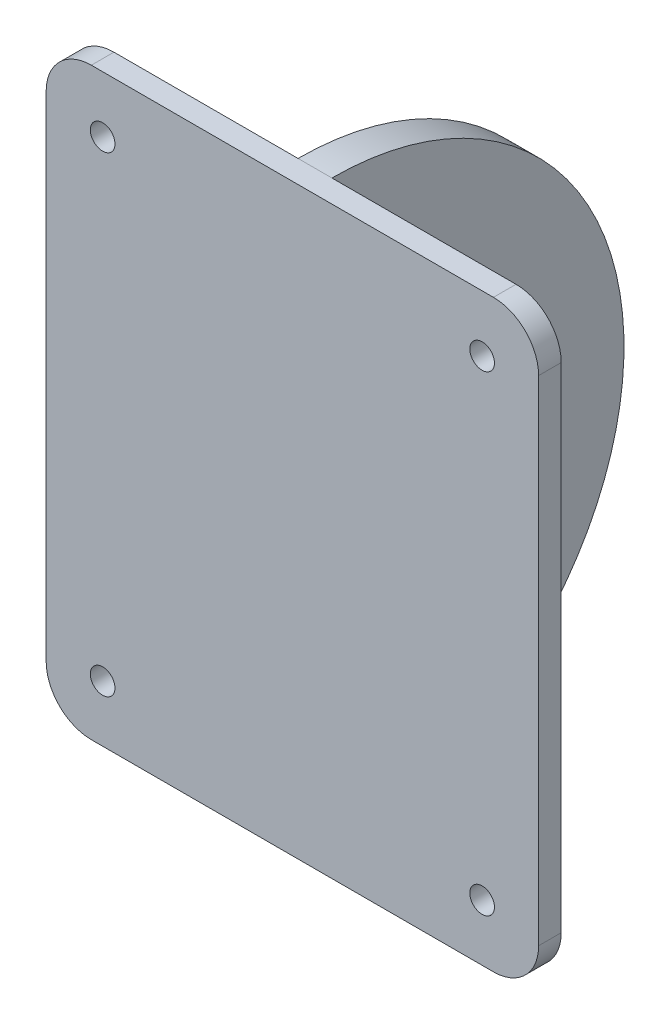
ISO-10303-21;
HEADER;
FILE_DESCRIPTION(('STEP AP214'),'2;1');
FILE_NAME('part.step','',(''),(''),'','','');
FILE_SCHEMA(('AUTOMOTIVE_DESIGN { 1 0 10303 214 1 1 1 1 }'));
ENDSEC;
DATA;
#1=APPLICATION_CONTEXT('core data for automotive mechanical design processes');
#2=APPLICATION_PROTOCOL_DEFINITION('international standard','automotive_design',2000,#1);
#3=PRODUCT_CONTEXT('',#1,'mechanical');
#4=PRODUCT('Part','Part','',(#3));
#5=PRODUCT_RELATED_PRODUCT_CATEGORY('part','',(#4));
#6=PRODUCT_DEFINITION_FORMATION('','',#4);
#7=PRODUCT_DEFINITION_CONTEXT('part definition',#1,'design');
#8=PRODUCT_DEFINITION('design','',#6,#7);
#9=PRODUCT_DEFINITION_SHAPE('','',#8);
#10=(LENGTH_UNIT() NAMED_UNIT(*) SI_UNIT(.MILLI.,.METRE.));
#11=(NAMED_UNIT(*) PLANE_ANGLE_UNIT() SI_UNIT($,.RADIAN.));
#12=(NAMED_UNIT(*) SI_UNIT($,.STERADIAN.) SOLID_ANGLE_UNIT());
#13=UNCERTAINTY_MEASURE_WITH_UNIT(LENGTH_MEASURE(1.E-05),#10,'distance_accuracy_value','');
#14=(GEOMETRIC_REPRESENTATION_CONTEXT(3) GLOBAL_UNCERTAINTY_ASSIGNED_CONTEXT((#13)) GLOBAL_UNIT_ASSIGNED_CONTEXT((#10,
#11,#12)) REPRESENTATION_CONTEXT('',''));
#15=CARTESIAN_POINT('',(0.,0.,0.));
#16=DIRECTION('',(0.,0.,1.));
#17=DIRECTION('',(1.,0.,0.));
#18=AXIS2_PLACEMENT_3D('',#15,#16,#17);
#19=CARTESIAN_POINT('',(0.,0.,0.));
#20=DIRECTION('',(0.,0.,1.));
#21=DIRECTION('',(1.,0.,0.));
#22=AXIS2_PLACEMENT_3D('',#19,#20,#21);
#23=PLANE('',#22);
#24=CARTESIAN_POINT('',(-16.799,20.8583,0.));
#25=DIRECTION('',(0.,0.,1.));
#26=DIRECTION('',(1.,0.,0.));
#27=AXIS2_PLACEMENT_3D('',#24,#25,#26);
#28=CIRCLE('',#27,1.0922);
#29=CARTESIAN_POINT('',(-15.7068,20.8583,0.));
#30=VERTEX_POINT('',#29);
#31=EDGE_CURVE('E175',#30,#30,#28,.T.);
#32=ORIENTED_EDGE('',*,*,#31,.T.);
#33=EDGE_LOOP('',(#32));
#34=FACE_BOUND('',#33,.T.);
#35=CARTESIAN_POINT('',(-16.799,-20.8583,0.));
#36=DIRECTION('',(0.,0.,1.));
#37=DIRECTION('',(1.,0.,0.));
#38=AXIS2_PLACEMENT_3D('',#35,#36,#37);
#39=CIRCLE('',#38,1.0922);
#40=CARTESIAN_POINT('',(-15.7068,-20.8583,0.));
#41=VERTEX_POINT('',#40);
#42=EDGE_CURVE('E160',#41,#41,#39,.T.);
#43=ORIENTED_EDGE('',*,*,#42,.T.);
#44=EDGE_LOOP('',(#43));
#45=FACE_BOUND('',#44,.T.);
#46=DIRECTION('',(0.,-1.,0.));
#47=VECTOR('',#46,1.);
#48=CARTESIAN_POINT('',(-1.5,25.8583,0.));
#49=LINE('',#48,#47);
#50=CARTESIAN_POINT('',(-1.5,25.8583,0.));
#51=VERTEX_POINT('',#50);
#52=CARTESIAN_POINT('',(-1.5,-25.8583,0.));
#53=VERTEX_POINT('',#52);
#54=EDGE_CURVE('E133',#51,#53,#49,.T.);
#55=ORIENTED_EDGE('',*,*,#54,.T.);
#56=DIRECTION('',(1.,0.,0.));
#57=VECTOR('',#56,1.);
#58=CARTESIAN_POINT('',(-21.799,-25.8583,0.));
#59=LINE('',#58,#57);
#60=CARTESIAN_POINT('',(-17.799,-25.8583,0.));
#61=VERTEX_POINT('',#60);
#62=EDGE_CURVE('E184',#61,#53,#59,.T.);
#63=ORIENTED_EDGE('',*,*,#62,.F.);
#64=CARTESIAN_POINT('',(-17.799,-21.8583,0.));
#65=DIRECTION('',(0.,0.,1.));
#66=DIRECTION('',(1.,0.,0.));
#67=AXIS2_PLACEMENT_3D('',#64,#65,#66);
#68=CIRCLE('',#67,4.);
#69=CARTESIAN_POINT('',(-21.799,-21.8583,0.));
#70=VERTEX_POINT('',#69);
#71=EDGE_CURVE('E209',#61,#70,#68,.F.);
#72=ORIENTED_EDGE('',*,*,#71,.T.);
#73=DIRECTION('',(0.,-1.,0.));
#74=VECTOR('',#73,1.);
#75=CARTESIAN_POINT('',(-21.799,25.8583,0.));
#76=LINE('',#75,#74);
#77=CARTESIAN_POINT('',(-21.799,21.8583,0.));
#78=VERTEX_POINT('',#77);
#79=EDGE_CURVE('E196',#78,#70,#76,.T.);
#80=ORIENTED_EDGE('',*,*,#79,.F.);
#81=CARTESIAN_POINT('',(-17.799,21.8583,0.));
#82=DIRECTION('',(0.,0.,1.));
#83=DIRECTION('',(1.,0.,0.));
#84=AXIS2_PLACEMENT_3D('',#81,#82,#83);
#85=CIRCLE('',#84,4.);
#86=CARTESIAN_POINT('',(-17.799,25.8583,0.));
#87=VERTEX_POINT('',#86);
#88=EDGE_CURVE('E136',#78,#87,#85,.F.);
#89=ORIENTED_EDGE('',*,*,#88,.T.);
#90=DIRECTION('',(-1.,0.,0.));
#91=VECTOR('',#90,1.);
#92=CARTESIAN_POINT('',(-21.799,25.8583,0.));
#93=LINE('',#92,#91);
#94=EDGE_CURVE('E119',#51,#87,#93,.T.);
#95=ORIENTED_EDGE('',*,*,#94,.F.);
#96=EDGE_LOOP('',(#55,#63,#72,#80,#89,#95));
#97=FACE_BOUND('',#96,.T.);
#98=ADVANCED_FACE('F41',(#34,#45,#97),#23,.F.);
#99=CARTESIAN_POINT('',(21.799,25.8583,2.));
#100=DIRECTION('',(-1.,0.,0.));
#101=DIRECTION('',(0.,-1.,0.));
#102=AXIS2_PLACEMENT_3D('',#99,#100,#101);
#103=PLANE('',#102);
#104=DIRECTION('',(0.,1.,0.));
#105=VECTOR('',#104,1.);
#106=CARTESIAN_POINT('',(21.799,25.8583,2.));
#107=LINE('',#106,#105);
#108=CARTESIAN_POINT('',(21.799,-21.8583,2.));
#109=VERTEX_POINT('',#108);
#110=CARTESIAN_POINT('',(21.799,21.8583,2.));
#111=VERTEX_POINT('',#110);
#112=EDGE_CURVE('E180',#109,#111,#107,.T.);
#113=ORIENTED_EDGE('',*,*,#112,.F.);
#114=DIRECTION('',(0.,0.,-1.));
#115=VECTOR('',#114,1.);
#116=CARTESIAN_POINT('',(21.799,-21.8583,2.));
#117=LINE('',#116,#115);
#118=CARTESIAN_POINT('',(21.799,-21.8583,0.));
#119=VERTEX_POINT('',#118);
#120=EDGE_CURVE('E226',#109,#119,#117,.T.);
#121=ORIENTED_EDGE('',*,*,#120,.T.);
#122=DIRECTION('',(0.,1.,0.));
#123=VECTOR('',#122,1.);
#124=CARTESIAN_POINT('',(21.799,25.8583,0.));
#125=LINE('',#124,#123);
#126=CARTESIAN_POINT('',(21.799,21.8583,0.));
#127=VERTEX_POINT('',#126);
#128=EDGE_CURVE('E138',#119,#127,#125,.T.);
#129=ORIENTED_EDGE('',*,*,#128,.T.);
#130=DIRECTION('',(0.,0.,-1.));
#131=VECTOR('',#130,1.);
#132=CARTESIAN_POINT('',(21.799,21.8583,2.));
#133=LINE('',#132,#131);
#134=EDGE_CURVE('E224',#127,#111,#133,.F.);
#135=ORIENTED_EDGE('',*,*,#134,.T.);
#136=EDGE_LOOP('',(#113,#121,#129,#135));
#137=FACE_BOUND('',#136,.T.);
#138=ADVANCED_FACE('F237',(#137),#103,.F.);
#139=CARTESIAN_POINT('',(-21.799,25.8583,2.));
#140=DIRECTION('',(0.,-1.,0.));
#141=DIRECTION('',(0.,0.,-1.));
#142=AXIS2_PLACEMENT_3D('',#139,#140,#141);
#143=PLANE('',#142);
#144=CARTESIAN_POINT('',(17.799,25.8583,0.));
#145=VERTEX_POINT('',#144);
#146=CARTESIAN_POINT('',(1.5,25.8583,0.));
#147=VERTEX_POINT('',#146);
#148=EDGE_CURVE('E122',#145,#147,#93,.T.);
#149=ORIENTED_EDGE('',*,*,#148,.T.);
#150=DIRECTION('',(-1.,0.,0.));
#151=VECTOR('',#150,1.);
#152=CARTESIAN_POINT('',(1.5,25.8583,0.));
#153=LINE('',#152,#151);
#154=EDGE_CURVE('E116',#147,#51,#153,.T.);
#155=ORIENTED_EDGE('',*,*,#154,.T.);
#156=ORIENTED_EDGE('',*,*,#94,.T.);
#157=DIRECTION('',(0.,0.,-1.));
#158=VECTOR('',#157,1.);
#159=CARTESIAN_POINT('',(-17.799,25.8583,2.));
#160=LINE('',#159,#158);
#161=CARTESIAN_POINT('',(-17.799,25.8583,2.));
#162=VERTEX_POINT('',#161);
#163=EDGE_CURVE('E11',#87,#162,#160,.F.);
#164=ORIENTED_EDGE('',*,*,#163,.T.);
#165=DIRECTION('',(-1.,0.,0.));
#166=VECTOR('',#165,1.);
#167=CARTESIAN_POINT('',(-21.799,25.8583,2.));
#168=LINE('',#167,#166);
#169=CARTESIAN_POINT('',(17.799,25.8583,2.));
#170=VERTEX_POINT('',#169);
#171=EDGE_CURVE('E183',#170,#162,#168,.T.);
#172=ORIENTED_EDGE('',*,*,#171,.F.);
#173=DIRECTION('',(0.,0.,-1.));
#174=VECTOR('',#173,1.);
#175=CARTESIAN_POINT('',(17.799,25.8583,2.));
#176=LINE('',#175,#174);
#177=EDGE_CURVE('E49',#170,#145,#176,.T.);
#178=ORIENTED_EDGE('',*,*,#177,.T.);
#179=EDGE_LOOP('',(#149,#155,#156,#164,#172,#178));
#180=FACE_BOUND('',#179,.T.);
#181=ADVANCED_FACE('F118',(#180),#143,.F.);
#182=CARTESIAN_POINT('',(-21.799,25.8583,2.));
#183=DIRECTION('',(1.,0.,0.));
#184=DIRECTION('',(0.,1.,0.));
#185=AXIS2_PLACEMENT_3D('',#182,#183,#184);
#186=PLANE('',#185);
#187=ORIENTED_EDGE('',*,*,#79,.T.);
#188=DIRECTION('',(0.,0.,-1.));
#189=VECTOR('',#188,1.);
#190=CARTESIAN_POINT('',(-21.799,-21.8583,2.));
#191=LINE('',#190,#189);
#192=CARTESIAN_POINT('',(-21.799,-21.8583,2.));
#193=VERTEX_POINT('',#192);
#194=EDGE_CURVE('E214',#70,#193,#191,.F.);
#195=ORIENTED_EDGE('',*,*,#194,.T.);
#196=DIRECTION('',(0.,-1.,0.));
#197=VECTOR('',#196,1.);
#198=CARTESIAN_POINT('',(-21.799,25.8583,2.));
#199=LINE('',#198,#197);
#200=CARTESIAN_POINT('',(-21.799,21.8583,2.));
#201=VERTEX_POINT('',#200);
#202=EDGE_CURVE('E187',#201,#193,#199,.T.);
#203=ORIENTED_EDGE('',*,*,#202,.F.);
#204=DIRECTION('',(0.,0.,-1.));
#205=VECTOR('',#204,1.);
#206=CARTESIAN_POINT('',(-21.799,21.8583,2.));
#207=LINE('',#206,#205);
#208=EDGE_CURVE('E211',#201,#78,#207,.T.);
#209=ORIENTED_EDGE('',*,*,#208,.T.);
#210=EDGE_LOOP('',(#187,#195,#203,#209));
#211=FACE_BOUND('',#210,.T.);
#212=ADVANCED_FACE('F256',(#211),#186,.F.);
#213=CARTESIAN_POINT('',(-21.799,-25.8583,2.));
#214=DIRECTION('',(0.,1.,0.));
#215=DIRECTION('',(0.,0.,1.));
#216=AXIS2_PLACEMENT_3D('',#213,#214,#215);
#217=PLANE('',#216);
#218=DIRECTION('',(1.,0.,0.));
#219=VECTOR('',#218,1.);
#220=CARTESIAN_POINT('',(-21.799,-25.8583,2.));
#221=LINE('',#220,#219);
#222=CARTESIAN_POINT('',(-17.799,-25.8583,2.));
#223=VERTEX_POINT('',#222);
#224=CARTESIAN_POINT('',(17.799,-25.8583,2.));
#225=VERTEX_POINT('',#224);
#226=EDGE_CURVE('E190',#223,#225,#221,.T.);
#227=ORIENTED_EDGE('',*,*,#226,.F.);
#228=DIRECTION('',(0.,0.,-1.));
#229=VECTOR('',#228,1.);
#230=CARTESIAN_POINT('',(-17.799,-25.8583,2.));
#231=LINE('',#230,#229);
#232=EDGE_CURVE('E201',#223,#61,#231,.T.);
#233=ORIENTED_EDGE('',*,*,#232,.T.);
#234=ORIENTED_EDGE('',*,*,#62,.T.);
#235=DIRECTION('',(-1.,0.,0.));
#236=VECTOR('',#235,1.);
#237=CARTESIAN_POINT('',(1.5,-25.8583,0.));
#238=LINE('',#237,#236);
#239=CARTESIAN_POINT('',(1.5,-25.8583,0.));
#240=VERTEX_POINT('',#239);
#241=EDGE_CURVE('E128',#240,#53,#238,.T.);
#242=ORIENTED_EDGE('',*,*,#241,.F.);
#243=CARTESIAN_POINT('',(17.799,-25.8583,0.));
#244=VERTEX_POINT('',#243);
#245=EDGE_CURVE('E61',#240,#244,#59,.T.);
#246=ORIENTED_EDGE('',*,*,#245,.T.);
#247=DIRECTION('',(0.,0.,-1.));
#248=VECTOR('',#247,1.);
#249=CARTESIAN_POINT('',(17.799,-25.8583,2.));
#250=LINE('',#249,#248);
#251=EDGE_CURVE('E193',#244,#225,#250,.F.);
#252=ORIENTED_EDGE('',*,*,#251,.T.);
#253=EDGE_LOOP('',(#227,#233,#234,#242,#246,#252));
#254=FACE_BOUND('',#253,.T.);
#255=ADVANCED_FACE('F248',(#254),#217,.F.);
#256=CARTESIAN_POINT('',(0.,0.,2.));
#257=DIRECTION('',(0.,0.,1.));
#258=DIRECTION('',(1.,0.,0.));
#259=AXIS2_PLACEMENT_3D('',#256,#257,#258);
#260=PLANE('',#259);
#261=CARTESIAN_POINT('',(16.799,20.8583,2.));
#262=DIRECTION('',(0.,0.,1.));
#263=DIRECTION('',(1.,0.,0.));
#264=AXIS2_PLACEMENT_3D('',#261,#262,#263);
#265=CIRCLE('',#264,1.0922);
#266=CARTESIAN_POINT('',(17.8912,20.8583,2.));
#267=VERTEX_POINT('',#266);
#268=EDGE_CURVE('E163',#267,#267,#265,.T.);
#269=ORIENTED_EDGE('',*,*,#268,.F.);
#270=EDGE_LOOP('',(#269));
#271=FACE_BOUND('',#270,.T.);
#272=CARTESIAN_POINT('',(-16.799,-20.8583,2.));
#273=DIRECTION('',(0.,0.,1.));
#274=DIRECTION('',(1.,0.,0.));
#275=AXIS2_PLACEMENT_3D('',#272,#273,#274);
#276=CIRCLE('',#275,1.0922);
#277=CARTESIAN_POINT('',(-15.7068,-20.8583,2.));
#278=VERTEX_POINT('',#277);
#279=EDGE_CURVE('E170',#278,#278,#276,.T.);
#280=ORIENTED_EDGE('',*,*,#279,.F.);
#281=EDGE_LOOP('',(#280));
#282=FACE_BOUND('',#281,.T.);
#283=CARTESIAN_POINT('',(16.799,-20.8583,2.));
#284=DIRECTION('',(0.,0.,1.));
#285=DIRECTION('',(1.,0.,0.));
#286=AXIS2_PLACEMENT_3D('',#283,#284,#285);
#287=CIRCLE('',#286,1.0922);
#288=CARTESIAN_POINT('',(17.8912,-20.8583,2.));
#289=VERTEX_POINT('',#288);
#290=EDGE_CURVE('E157',#289,#289,#287,.T.);
#291=ORIENTED_EDGE('',*,*,#290,.F.);
#292=EDGE_LOOP('',(#291));
#293=FACE_BOUND('',#292,.T.);
#294=CARTESIAN_POINT('',(-16.799,20.8583,2.));
#295=DIRECTION('',(0.,0.,1.));
#296=DIRECTION('',(1.,0.,0.));
#297=AXIS2_PLACEMENT_3D('',#294,#295,#296);
#298=CIRCLE('',#297,1.0922);
#299=CARTESIAN_POINT('',(-15.7068,20.8583,2.));
#300=VERTEX_POINT('',#299);
#301=EDGE_CURVE('E166',#300,#300,#298,.T.);
#302=ORIENTED_EDGE('',*,*,#301,.F.);
#303=EDGE_LOOP('',(#302));
#304=FACE_BOUND('',#303,.T.);
#305=ORIENTED_EDGE('',*,*,#202,.T.);
#306=CARTESIAN_POINT('',(-17.799,-21.8583,2.));
#307=DIRECTION('',(0.,0.,1.));
#308=DIRECTION('',(1.,0.,0.));
#309=AXIS2_PLACEMENT_3D('',#306,#307,#308);
#310=CIRCLE('',#309,4.);
#311=EDGE_CURVE('E222',#193,#223,#310,.T.);
#312=ORIENTED_EDGE('',*,*,#311,.T.);
#313=ORIENTED_EDGE('',*,*,#226,.T.);
#314=CARTESIAN_POINT('',(17.799,-21.8583,2.));
#315=DIRECTION('',(0.,0.,1.));
#316=DIRECTION('',(1.,0.,0.));
#317=AXIS2_PLACEMENT_3D('',#314,#315,#316);
#318=CIRCLE('',#317,4.);
#319=EDGE_CURVE('E220',#225,#109,#318,.T.);
#320=ORIENTED_EDGE('',*,*,#319,.T.);
#321=ORIENTED_EDGE('',*,*,#112,.T.);
#322=CARTESIAN_POINT('',(17.799,21.8583,2.));
#323=DIRECTION('',(0.,0.,1.));
#324=DIRECTION('',(1.,0.,0.));
#325=AXIS2_PLACEMENT_3D('',#322,#323,#324);
#326=CIRCLE('',#325,4.);
#327=EDGE_CURVE('E216',#111,#170,#326,.T.);
#328=ORIENTED_EDGE('',*,*,#327,.T.);
#329=ORIENTED_EDGE('',*,*,#171,.T.);
#330=CARTESIAN_POINT('',(-17.799,21.8583,2.));
#331=DIRECTION('',(0.,0.,1.));
#332=DIRECTION('',(1.,0.,0.));
#333=AXIS2_PLACEMENT_3D('',#330,#331,#332);
#334=CIRCLE('',#333,4.);
#335=EDGE_CURVE('E218',#162,#201,#334,.T.);
#336=ORIENTED_EDGE('',*,*,#335,.T.);
#337=EDGE_LOOP('',(#305,#312,#313,#320,#321,#328,#329,#336));
#338=FACE_BOUND('',#337,.T.);
#339=ADVANCED_FACE('F240',(#271,#282,#293,#304,#338),#260,.T.);
#340=CARTESIAN_POINT('',(16.799,20.8583,0.));
#341=DIRECTION('',(0.,0.,1.));
#342=DIRECTION('',(1.,0.,0.));
#343=AXIS2_PLACEMENT_3D('',#340,#341,#342);
#344=CIRCLE('',#343,1.0922);
#345=CARTESIAN_POINT('',(17.8912,20.8583,0.));
#346=VERTEX_POINT('',#345);
#347=EDGE_CURVE('E167',#346,#346,#344,.T.);
#348=ORIENTED_EDGE('',*,*,#347,.T.);
#349=EDGE_LOOP('',(#348));
#350=FACE_BOUND('',#349,.T.);
#351=CARTESIAN_POINT('',(16.799,-20.8583,0.));
#352=DIRECTION('',(0.,0.,1.));
#353=DIRECTION('',(1.,0.,0.));
#354=AXIS2_PLACEMENT_3D('',#351,#352,#353);
#355=CIRCLE('',#354,1.0922);
#356=CARTESIAN_POINT('',(17.8912,-20.8583,0.));
#357=VERTEX_POINT('',#356);
#358=EDGE_CURVE('E127',#357,#357,#355,.T.);
#359=ORIENTED_EDGE('',*,*,#358,.T.);
#360=EDGE_LOOP('',(#359));
#361=FACE_BOUND('',#360,.T.);
#362=ORIENTED_EDGE('',*,*,#245,.F.);
#363=DIRECTION('',(0.,-1.,0.));
#364=VECTOR('',#363,1.);
#365=CARTESIAN_POINT('',(1.5,25.8583,0.));
#366=LINE('',#365,#364);
#367=EDGE_CURVE('E56',#147,#240,#366,.T.);
#368=ORIENTED_EDGE('',*,*,#367,.F.);
#369=ORIENTED_EDGE('',*,*,#148,.F.);
#370=CARTESIAN_POINT('',(17.799,21.8583,0.));
#371=DIRECTION('',(0.,0.,1.));
#372=DIRECTION('',(1.,0.,0.));
#373=AXIS2_PLACEMENT_3D('',#370,#371,#372);
#374=CIRCLE('',#373,4.);
#375=EDGE_CURVE('E204',#145,#127,#374,.F.);
#376=ORIENTED_EDGE('',*,*,#375,.T.);
#377=ORIENTED_EDGE('',*,*,#128,.F.);
#378=CARTESIAN_POINT('',(17.799,-21.8583,0.));
#379=DIRECTION('',(0.,0.,1.));
#380=DIRECTION('',(1.,0.,0.));
#381=AXIS2_PLACEMENT_3D('',#378,#379,#380);
#382=CIRCLE('',#381,4.);
#383=EDGE_CURVE('E207',#119,#244,#382,.F.);
#384=ORIENTED_EDGE('',*,*,#383,.T.);
#385=EDGE_LOOP('',(#362,#368,#369,#376,#377,#384));
#386=FACE_BOUND('',#385,.T.);
#387=ADVANCED_FACE('F232',(#350,#361,#386),#23,.F.);
#388=CARTESIAN_POINT('',(-17.799,-21.8583,2.));
#389=DIRECTION('',(0.,0.,-1.));
#390=DIRECTION('',(-1.,0.,0.));
#391=AXIS2_PLACEMENT_3D('',#388,#389,#390);
#392=CYLINDRICAL_SURFACE('',#391,4.);
#393=ORIENTED_EDGE('',*,*,#311,.F.);
#394=ORIENTED_EDGE('',*,*,#194,.F.);
#395=ORIENTED_EDGE('',*,*,#71,.F.);
#396=ORIENTED_EDGE('',*,*,#232,.F.);
#397=EDGE_LOOP('',(#393,#394,#395,#396));
#398=FACE_BOUND('',#397,.T.);
#399=ADVANCED_FACE('F254',(#398),#392,.T.);
#400=CARTESIAN_POINT('',(17.799,-21.8583,2.));
#401=DIRECTION('',(0.,0.,-1.));
#402=DIRECTION('',(-1.,0.,0.));
#403=AXIS2_PLACEMENT_3D('',#400,#401,#402);
#404=CYLINDRICAL_SURFACE('',#403,4.);
#405=ORIENTED_EDGE('',*,*,#319,.F.);
#406=ORIENTED_EDGE('',*,*,#251,.F.);
#407=ORIENTED_EDGE('',*,*,#383,.F.);
#408=ORIENTED_EDGE('',*,*,#120,.F.);
#409=EDGE_LOOP('',(#405,#406,#407,#408));
#410=FACE_BOUND('',#409,.T.);
#411=ADVANCED_FACE('F244',(#410),#404,.T.);
#412=CARTESIAN_POINT('',(-17.799,21.8583,2.));
#413=DIRECTION('',(0.,0.,-1.));
#414=DIRECTION('',(-1.,0.,0.));
#415=AXIS2_PLACEMENT_3D('',#412,#413,#414);
#416=CYLINDRICAL_SURFACE('',#415,4.);
#417=ORIENTED_EDGE('',*,*,#335,.F.);
#418=ORIENTED_EDGE('',*,*,#163,.F.);
#419=ORIENTED_EDGE('',*,*,#88,.F.);
#420=ORIENTED_EDGE('',*,*,#208,.F.);
#421=EDGE_LOOP('',(#417,#418,#419,#420));
#422=FACE_BOUND('',#421,.T.);
#423=ADVANCED_FACE('F259',(#422),#416,.T.);
#424=CARTESIAN_POINT('',(17.799,21.8583,2.));
#425=DIRECTION('',(0.,0.,-1.));
#426=DIRECTION('',(-1.,0.,0.));
#427=AXIS2_PLACEMENT_3D('',#424,#425,#426);
#428=CYLINDRICAL_SURFACE('',#427,4.);
#429=ORIENTED_EDGE('',*,*,#327,.F.);
#430=ORIENTED_EDGE('',*,*,#134,.F.);
#431=ORIENTED_EDGE('',*,*,#375,.F.);
#432=ORIENTED_EDGE('',*,*,#177,.F.);
#433=EDGE_LOOP('',(#429,#430,#431,#432));
#434=FACE_BOUND('',#433,.T.);
#435=ADVANCED_FACE('F43',(#434),#428,.T.);
#436=CARTESIAN_POINT('',(-16.799,20.8583,0.));
#437=DIRECTION('',(0.,0.,1.));
#438=DIRECTION('',(1.,0.,0.));
#439=AXIS2_PLACEMENT_3D('',#436,#437,#438);
#440=CYLINDRICAL_SURFACE('',#439,1.0922);
#441=ORIENTED_EDGE('',*,*,#31,.F.);
#442=EDGE_LOOP('',(#441));
#443=FACE_BOUND('',#442,.T.);
#444=ORIENTED_EDGE('',*,*,#301,.T.);
#445=EDGE_LOOP('',(#444));
#446=FACE_BOUND('',#445,.T.);
#447=ADVANCED_FACE('F265',(#443,#446),#440,.F.);
#448=CARTESIAN_POINT('',(16.799,-20.8583,0.));
#449=DIRECTION('',(0.,0.,1.));
#450=DIRECTION('',(1.,0.,0.));
#451=AXIS2_PLACEMENT_3D('',#448,#449,#450);
#452=CYLINDRICAL_SURFACE('',#451,1.0922);
#453=ORIENTED_EDGE('',*,*,#358,.F.);
#454=EDGE_LOOP('',(#453));
#455=FACE_BOUND('',#454,.T.);
#456=ORIENTED_EDGE('',*,*,#290,.T.);
#457=EDGE_LOOP('',(#456));
#458=FACE_BOUND('',#457,.T.);
#459=ADVANCED_FACE('F289',(#455,#458),#452,.F.);
#460=CARTESIAN_POINT('',(-16.799,-20.8583,0.));
#461=DIRECTION('',(0.,0.,1.));
#462=DIRECTION('',(1.,0.,0.));
#463=AXIS2_PLACEMENT_3D('',#460,#461,#462);
#464=CYLINDRICAL_SURFACE('',#463,1.0922);
#465=ORIENTED_EDGE('',*,*,#42,.F.);
#466=EDGE_LOOP('',(#465));
#467=FACE_BOUND('',#466,.T.);
#468=ORIENTED_EDGE('',*,*,#279,.T.);
#469=EDGE_LOOP('',(#468));
#470=FACE_BOUND('',#469,.T.);
#471=ADVANCED_FACE('F292',(#467,#470),#464,.F.);
#472=CARTESIAN_POINT('',(16.799,20.8583,0.));
#473=DIRECTION('',(0.,0.,1.));
#474=DIRECTION('',(1.,0.,0.));
#475=AXIS2_PLACEMENT_3D('',#472,#473,#474);
#476=CYLINDRICAL_SURFACE('',#475,1.0922);
#477=ORIENTED_EDGE('',*,*,#347,.F.);
#478=EDGE_LOOP('',(#477));
#479=FACE_BOUND('',#478,.T.);
#480=ORIENTED_EDGE('',*,*,#268,.T.);
#481=EDGE_LOOP('',(#480));
#482=FACE_BOUND('',#481,.T.);
#483=ADVANCED_FACE('F308',(#479,#482),#476,.F.);
#484=CARTESIAN_POINT('',(1.5,0.,0.));
#485=DIRECTION('',(-1.,0.,0.));
#486=DIRECTION('',(0.,0.,1.));
#487=AXIS2_PLACEMENT_3D('',#484,#485,#486);
#488=CYLINDRICAL_SURFACE('',#487,25.8583);
#489=CARTESIAN_POINT('',(-1.5,0.,0.));
#490=DIRECTION('',(1.,0.,0.));
#491=DIRECTION('',(0.,0.,-1.));
#492=AXIS2_PLACEMENT_3D('',#489,#490,#491);
#493=CIRCLE('',#492,25.8583);
#494=EDGE_CURVE('E143',#53,#51,#493,.T.);
#495=ORIENTED_EDGE('',*,*,#494,.T.);
#496=ORIENTED_EDGE('',*,*,#154,.F.);
#497=CARTESIAN_POINT('',(1.5,0.,0.));
#498=DIRECTION('',(1.,0.,0.));
#499=DIRECTION('',(0.,0.,-1.));
#500=AXIS2_PLACEMENT_3D('',#497,#498,#499);
#501=CIRCLE('',#500,25.8583);
#502=EDGE_CURVE('E144',#240,#147,#501,.T.);
#503=ORIENTED_EDGE('',*,*,#502,.F.);
#504=ORIENTED_EDGE('',*,*,#241,.T.);
#505=EDGE_LOOP('',(#495,#496,#503,#504));
#506=FACE_BOUND('',#505,.T.);
#507=ADVANCED_FACE('F147',(#506),#488,.T.);
#508=CARTESIAN_POINT('',(1.5,0.,0.));
#509=DIRECTION('',(1.,0.,0.));
#510=DIRECTION('',(0.,0.,-1.));
#511=AXIS2_PLACEMENT_3D('',#508,#509,#510);
#512=PLANE('',#511);
#513=CARTESIAN_POINT('',(1.5,0.,-10.61));
#514=DIRECTION('',(1.,0.,0.));
#515=DIRECTION('',(0.,0.,-1.));
#516=AXIS2_PLACEMENT_3D('',#513,#514,#515);
#517=CIRCLE('',#516,5.);
#518=CARTESIAN_POINT('',(1.5,0.,-15.61));
#519=VERTEX_POINT('',#518);
#520=EDGE_CURVE('E151',#519,#519,#517,.T.);
#521=ORIENTED_EDGE('',*,*,#520,.F.);
#522=EDGE_LOOP('',(#521));
#523=FACE_BOUND('',#522,.T.);
#524=ORIENTED_EDGE('',*,*,#502,.T.);
#525=ORIENTED_EDGE('',*,*,#367,.T.);
#526=EDGE_LOOP('',(#524,#525));
#527=FACE_BOUND('',#526,.T.);
#528=ADVANCED_FACE('F315',(#523,#527),#512,.T.);
#529=CARTESIAN_POINT('',(-1.5,0.,0.));
#530=DIRECTION('',(1.,0.,0.));
#531=DIRECTION('',(0.,0.,-1.));
#532=AXIS2_PLACEMENT_3D('',#529,#530,#531);
#533=PLANE('',#532);
#534=CARTESIAN_POINT('',(-1.5,0.,-10.61));
#535=DIRECTION('',(1.,0.,0.));
#536=DIRECTION('',(0.,0.,-1.));
#537=AXIS2_PLACEMENT_3D('',#534,#535,#536);
#538=CIRCLE('',#537,5.);
#539=CARTESIAN_POINT('',(-1.5,0.,-15.61));
#540=VERTEX_POINT('',#539);
#541=EDGE_CURVE('E148',#540,#540,#538,.F.);
#542=ORIENTED_EDGE('',*,*,#541,.F.);
#543=EDGE_LOOP('',(#542));
#544=FACE_BOUND('',#543,.T.);
#545=ORIENTED_EDGE('',*,*,#494,.F.);
#546=ORIENTED_EDGE('',*,*,#54,.F.);
#547=EDGE_LOOP('',(#545,#546));
#548=FACE_BOUND('',#547,.T.);
#549=ADVANCED_FACE('F142',(#544,#548),#533,.F.);
#550=CARTESIAN_POINT('',(-21.8,0.,-10.61));
#551=DIRECTION('',(1.,0.,0.));
#552=DIRECTION('',(0.,0.,-1.));
#553=AXIS2_PLACEMENT_3D('',#550,#551,#552);
#554=CYLINDRICAL_SURFACE('',#553,5.);
#555=ORIENTED_EDGE('',*,*,#520,.T.);
#556=EDGE_LOOP('',(#555));
#557=FACE_BOUND('',#556,.T.);
#558=ORIENTED_EDGE('',*,*,#541,.T.);
#559=EDGE_LOOP('',(#558));
#560=FACE_BOUND('',#559,.T.);
#561=ADVANCED_FACE('F318',(#557,#560),#554,.F.);
#562=CLOSED_SHELL('',(#98,#138,#181,#212,#255,#339,#387,#399,#411,#423,#435,#447,#459,#471,#483,
#507,#528,#549,#561));
#563=MANIFOLD_SOLID_BREP('B2',#562);
#564=ADVANCED_BREP_SHAPE_REPRESENTATION('',(#18,#563),#14);
#565=SHAPE_DEFINITION_REPRESENTATION(#9,#564);
ENDSEC;
END-ISO-10303-21;
